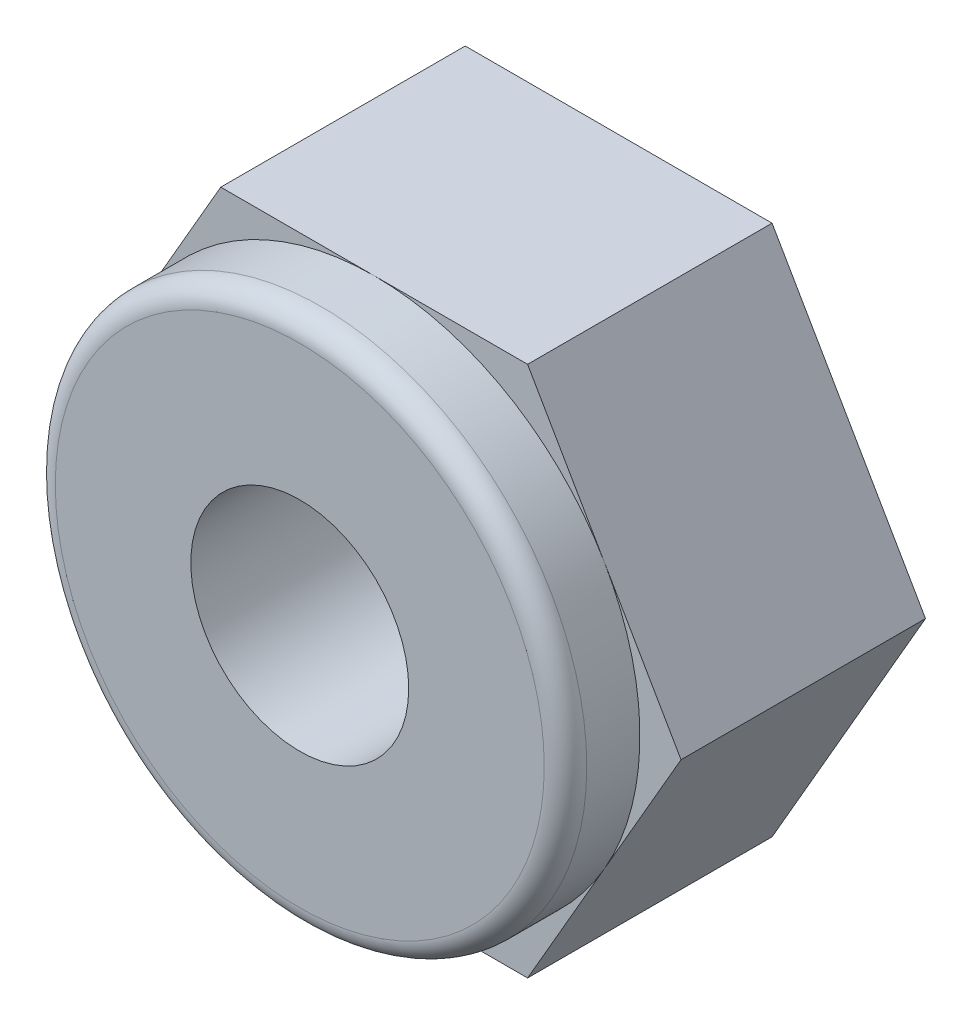
ISO-10303-21;
HEADER;
FILE_DESCRIPTION(('STEP AP214'),'2;1');
FILE_NAME('part.step','',(''),(''),'','','');
FILE_SCHEMA(('AUTOMOTIVE_DESIGN { 1 0 10303 214 1 1 1 1 }'));
ENDSEC;
DATA;
#1=APPLICATION_CONTEXT('core data for automotive mechanical design processes');
#2=APPLICATION_PROTOCOL_DEFINITION('international standard','automotive_design',2000,#1);
#3=PRODUCT_CONTEXT('',#1,'mechanical');
#4=PRODUCT('Part','Part','',(#3));
#5=PRODUCT_RELATED_PRODUCT_CATEGORY('part','',(#4));
#6=PRODUCT_DEFINITION_FORMATION('','',#4);
#7=PRODUCT_DEFINITION_CONTEXT('part definition',#1,'design');
#8=PRODUCT_DEFINITION('design','',#6,#7);
#9=PRODUCT_DEFINITION_SHAPE('','',#8);
#10=(LENGTH_UNIT() NAMED_UNIT(*) SI_UNIT(.MILLI.,.METRE.));
#11=(NAMED_UNIT(*) PLANE_ANGLE_UNIT() SI_UNIT($,.RADIAN.));
#12=(NAMED_UNIT(*) SI_UNIT($,.STERADIAN.) SOLID_ANGLE_UNIT());
#13=UNCERTAINTY_MEASURE_WITH_UNIT(LENGTH_MEASURE(1.E-05),#10,'distance_accuracy_value','');
#14=(GEOMETRIC_REPRESENTATION_CONTEXT(3) GLOBAL_UNCERTAINTY_ASSIGNED_CONTEXT((#13)) GLOBAL_UNIT_ASSIGNED_CONTEXT((#10,
#11,#12)) REPRESENTATION_CONTEXT('',''));
#15=CARTESIAN_POINT('',(0.,0.,0.));
#16=DIRECTION('',(0.,0.,1.));
#17=DIRECTION('',(1.,0.,0.));
#18=AXIS2_PLACEMENT_3D('',#15,#16,#17);
#19=CARTESIAN_POINT('',(0.,0.,2.3));
#20=DIRECTION('',(0.,0.,1.));
#21=DIRECTION('',(1.,0.,0.));
#22=AXIS2_PLACEMENT_3D('',#19,#20,#21);
#23=PLANE('',#22);
#24=DIRECTION('',(0.500000000000007,-0.866025403784435,0.));
#25=VECTOR('',#24,1.);
#26=CARTESIAN_POINT('',(-2.16506350946108,-1.25000000000001,2.3));
#27=LINE('',#26,#25);
#28=CARTESIAN_POINT('',(-2.16506350946108,-1.25000000000001,2.3));
#29=VERTEX_POINT('',#28);
#30=CARTESIAN_POINT('',(-1.44337567297404,-2.50000000000001,2.3));
#31=VERTEX_POINT('',#30);
#32=EDGE_CURVE('E123',#29,#31,#27,.T.);
#33=ORIENTED_EDGE('',*,*,#32,.T.);
#34=DIRECTION('',(1.,0.,0.));
#35=VECTOR('',#34,1.);
#36=CARTESIAN_POINT('',(0.,-2.50000000000001,2.3));
#37=LINE('',#36,#35);
#38=CARTESIAN_POINT('',(0.,-2.5,2.3));
#39=VERTEX_POINT('',#38);
#40=EDGE_CURVE('E93',#31,#39,#37,.T.);
#41=ORIENTED_EDGE('',*,*,#40,.T.);
#42=CARTESIAN_POINT('',(0.,0.,2.3));
#43=DIRECTION('',(0.,0.,-1.));
#44=DIRECTION('',(-1.,0.,0.));
#45=AXIS2_PLACEMENT_3D('',#42,#43,#44);
#46=CIRCLE('',#45,2.49999999999999);
#47=EDGE_CURVE('E103',#29,#39,#46,.F.);
#48=ORIENTED_EDGE('',*,*,#47,.F.);
#49=EDGE_LOOP('',(#33,#41,#48));
#50=FACE_BOUND('',#49,.T.);
#51=ADVANCED_FACE('F17',(#50),#23,.T.);
#52=CARTESIAN_POINT('',(0.,0.,2.3));
#53=DIRECTION('',(0.,0.,1.));
#54=DIRECTION('',(1.,0.,0.));
#55=AXIS2_PLACEMENT_3D('',#52,#53,#54);
#56=PLANE('',#55);
#57=DIRECTION('',(1.,0.,0.));
#58=VECTOR('',#57,1.);
#59=CARTESIAN_POINT('',(0.,-2.49999999999999,2.3));
#60=LINE('',#59,#58);
#61=CARTESIAN_POINT('',(1.44337567297408,-2.49999999999999,2.3));
#62=VERTEX_POINT('',#61);
#63=EDGE_CURVE('E133',#39,#62,#60,.T.);
#64=ORIENTED_EDGE('',*,*,#63,.T.);
#65=DIRECTION('',(0.499999999999995,0.866025403784442,0.));
#66=VECTOR('',#65,1.);
#67=CARTESIAN_POINT('',(1.44337567297409,-2.49999999999998,2.3));
#68=LINE('',#67,#66);
#69=CARTESIAN_POINT('',(2.1650635094611,-1.24999999999998,2.3));
#70=VERTEX_POINT('',#69);
#71=EDGE_CURVE('E128',#62,#70,#68,.T.);
#72=ORIENTED_EDGE('',*,*,#71,.T.);
#73=CARTESIAN_POINT('',(0.,0.,2.3));
#74=DIRECTION('',(0.,0.,-1.));
#75=DIRECTION('',(-1.,0.,0.));
#76=AXIS2_PLACEMENT_3D('',#73,#74,#75);
#77=CIRCLE('',#76,2.49999999999999);
#78=EDGE_CURVE('E127',#39,#70,#77,.F.);
#79=ORIENTED_EDGE('',*,*,#78,.F.);
#80=EDGE_LOOP('',(#64,#72,#79));
#81=FACE_BOUND('',#80,.T.);
#82=ADVANCED_FACE('F307',(#81),#56,.T.);
#83=CARTESIAN_POINT('',(0.,0.,2.3));
#84=DIRECTION('',(0.,0.,1.));
#85=DIRECTION('',(1.,0.,0.));
#86=AXIS2_PLACEMENT_3D('',#83,#84,#85);
#87=PLANE('',#86);
#88=DIRECTION('',(1.,0.,0.));
#89=VECTOR('',#88,1.);
#90=CARTESIAN_POINT('',(0.,2.49999999999999,2.3));
#91=LINE('',#90,#89);
#92=CARTESIAN_POINT('',(0.,2.49999999999999,2.3));
#93=VERTEX_POINT('',#92);
#94=CARTESIAN_POINT('',(-1.44337567297407,2.49999999999999,2.3));
#95=VERTEX_POINT('',#94);
#96=EDGE_CURVE('E130',#93,#95,#91,.F.);
#97=ORIENTED_EDGE('',*,*,#96,.T.);
#98=DIRECTION('',(-0.499999999999995,-0.866025403784441,0.));
#99=VECTOR('',#98,1.);
#100=CARTESIAN_POINT('',(-1.44337567297407,2.49999999999999,2.3));
#101=LINE('',#100,#99);
#102=CARTESIAN_POINT('',(-2.1650635094611,1.24999999999998,2.3));
#103=VERTEX_POINT('',#102);
#104=EDGE_CURVE('E161',#95,#103,#101,.T.);
#105=ORIENTED_EDGE('',*,*,#104,.T.);
#106=CARTESIAN_POINT('',(0.,0.,2.3));
#107=DIRECTION('',(0.,0.,-1.));
#108=DIRECTION('',(-1.,0.,0.));
#109=AXIS2_PLACEMENT_3D('',#106,#107,#108);
#110=CIRCLE('',#109,2.49999999999999);
#111=EDGE_CURVE('E107',#93,#103,#110,.F.);
#112=ORIENTED_EDGE('',*,*,#111,.F.);
#113=EDGE_LOOP('',(#97,#105,#112));
#114=FACE_BOUND('',#113,.T.);
#115=ADVANCED_FACE('F274',(#114),#87,.T.);
#116=CARTESIAN_POINT('',(0.,0.,2.8));
#117=DIRECTION('',(0.,0.,1.));
#118=DIRECTION('',(1.,0.,0.));
#119=AXIS2_PLACEMENT_3D('',#116,#117,#118);
#120=TOROIDAL_SURFACE('',#119,2.29999999999999,0.2);
#121=CARTESIAN_POINT('',(0.,0.,2.8));
#122=DIRECTION('',(0.,0.,-1.));
#123=DIRECTION('',(-1.,0.,0.));
#124=AXIS2_PLACEMENT_3D('',#121,#122,#123);
#125=CIRCLE('',#124,2.49999999999999);
#126=CARTESIAN_POINT('',(-2.49999999999999,0.,2.8));
#127=VERTEX_POINT('',#126);
#128=EDGE_CURVE('E159',#127,#127,#125,.T.);
#129=ORIENTED_EDGE('',*,*,#128,.F.);
#130=EDGE_LOOP('',(#129));
#131=FACE_BOUND('',#130,.T.);
#132=CARTESIAN_POINT('',(0.,0.,3.));
#133=DIRECTION('',(0.,0.,-1.));
#134=DIRECTION('',(1.,0.,0.));
#135=AXIS2_PLACEMENT_3D('',#132,#133,#134);
#136=CIRCLE('',#135,2.29999999999999);
#137=CARTESIAN_POINT('',(-2.29999999999999,0.,3.));
#138=VERTEX_POINT('',#137);
#139=CARTESIAN_POINT('',(2.29999999999999,0.,3.));
#140=VERTEX_POINT('',#139);
#141=EDGE_CURVE('E140',#138,#140,#136,.F.);
#142=ORIENTED_EDGE('',*,*,#141,.F.);
#143=CARTESIAN_POINT('',(0.,0.,3.));
#144=DIRECTION('',(0.,0.,-1.));
#145=DIRECTION('',(-1.,0.,0.));
#146=AXIS2_PLACEMENT_3D('',#143,#144,#145);
#147=CIRCLE('',#146,2.29999999999999);
#148=EDGE_CURVE('E110',#140,#138,#147,.F.);
#149=ORIENTED_EDGE('',*,*,#148,.F.);
#150=EDGE_LOOP('',(#142,#149));
#151=FACE_BOUND('',#150,.T.);
#152=ADVANCED_FACE('F139',(#131,#151),#120,.T.);
#153=CARTESIAN_POINT('',(0.,0.,3.));
#154=DIRECTION('',(0.,0.,-1.));
#155=DIRECTION('',(-1.,0.,0.));
#156=AXIS2_PLACEMENT_3D('',#153,#154,#155);
#157=CYLINDRICAL_SURFACE('',#156,2.49999999999999);
#158=ORIENTED_EDGE('',*,*,#128,.T.);
#159=EDGE_LOOP('',(#158));
#160=FACE_BOUND('',#159,.T.);
#161=CARTESIAN_POINT('',(0.,0.,2.3));
#162=DIRECTION('',(0.,0.,-1.));
#163=DIRECTION('',(-1.,0.,0.));
#164=AXIS2_PLACEMENT_3D('',#161,#162,#163);
#165=CIRCLE('',#164,2.49999999999999);
#166=EDGE_CURVE('E99',#103,#29,#165,.F.);
#167=ORIENTED_EDGE('',*,*,#166,.T.);
#168=ORIENTED_EDGE('',*,*,#47,.T.);
#169=ORIENTED_EDGE('',*,*,#78,.T.);
#170=CARTESIAN_POINT('',(0.,0.,2.3));
#171=DIRECTION('',(0.,0.,-1.));
#172=DIRECTION('',(-1.,0.,0.));
#173=AXIS2_PLACEMENT_3D('',#170,#171,#172);
#174=CIRCLE('',#173,2.49999999999999);
#175=CARTESIAN_POINT('',(2.16506350946109,1.25,2.3));
#176=VERTEX_POINT('',#175);
#177=EDGE_CURVE('E158',#70,#176,#174,.F.);
#178=ORIENTED_EDGE('',*,*,#177,.T.);
#179=CARTESIAN_POINT('',(0.,0.,2.3));
#180=DIRECTION('',(0.,0.,-1.));
#181=DIRECTION('',(-1.,0.,0.));
#182=AXIS2_PLACEMENT_3D('',#179,#180,#181);
#183=CIRCLE('',#182,2.49999999999999);
#184=EDGE_CURVE('E144',#93,#176,#183,.T.);
#185=ORIENTED_EDGE('',*,*,#184,.F.);
#186=ORIENTED_EDGE('',*,*,#111,.T.);
#187=EDGE_LOOP('',(#167,#168,#169,#178,#185,#186));
#188=FACE_BOUND('',#187,.T.);
#189=ADVANCED_FACE('F101',(#160,#188),#157,.T.);
#190=CARTESIAN_POINT('',(0.,0.,3.));
#191=DIRECTION('',(0.,0.,1.));
#192=DIRECTION('',(1.,0.,0.));
#193=AXIS2_PLACEMENT_3D('',#190,#191,#192);
#194=PLANE('',#193);
#195=ORIENTED_EDGE('',*,*,#148,.T.);
#196=ORIENTED_EDGE('',*,*,#141,.T.);
#197=EDGE_LOOP('',(#195,#196));
#198=FACE_BOUND('',#197,.T.);
#199=CARTESIAN_POINT('',(0.,0.,3.));
#200=DIRECTION('',(0.,0.,1.));
#201=DIRECTION('',(1.,0.,0.));
#202=AXIS2_PLACEMENT_3D('',#199,#200,#201);
#203=CIRCLE('',#202,1.025);
#204=CARTESIAN_POINT('',(1.025,0.,3.));
#205=VERTEX_POINT('',#204);
#206=EDGE_CURVE('E153',#205,#205,#203,.F.);
#207=ORIENTED_EDGE('',*,*,#206,.T.);
#208=EDGE_LOOP('',(#207));
#209=FACE_BOUND('',#208,.T.);
#210=ADVANCED_FACE('F248',(#198,#209),#194,.T.);
#211=CARTESIAN_POINT('',(0.,0.,2.3));
#212=DIRECTION('',(0.,0.,1.));
#213=DIRECTION('',(1.,0.,0.));
#214=AXIS2_PLACEMENT_3D('',#211,#212,#213);
#215=PLANE('',#214);
#216=DIRECTION('',(0.500000000000001,-0.866025403784438,0.));
#217=VECTOR('',#216,1.);
#218=CARTESIAN_POINT('',(2.88675134594812,0.,2.3));
#219=LINE('',#218,#217);
#220=CARTESIAN_POINT('',(1.44337567297405,2.5,2.3));
#221=VERTEX_POINT('',#220);
#222=EDGE_CURVE('E215',#176,#221,#219,.F.);
#223=ORIENTED_EDGE('',*,*,#222,.T.);
#224=DIRECTION('',(1.,0.,0.));
#225=VECTOR('',#224,1.);
#226=CARTESIAN_POINT('',(0.,2.5,2.3));
#227=LINE('',#226,#225);
#228=EDGE_CURVE('E147',#221,#93,#227,.F.);
#229=ORIENTED_EDGE('',*,*,#228,.T.);
#230=ORIENTED_EDGE('',*,*,#184,.T.);
#231=EDGE_LOOP('',(#223,#229,#230));
#232=FACE_BOUND('',#231,.T.);
#233=ADVANCED_FACE('F258',(#232),#215,.T.);
#234=CARTESIAN_POINT('',(0.,0.,2.3));
#235=DIRECTION('',(0.,0.,1.));
#236=DIRECTION('',(1.,0.,0.));
#237=AXIS2_PLACEMENT_3D('',#234,#235,#236);
#238=PLANE('',#237);
#239=DIRECTION('',(-0.500000000000007,0.866025403784435,0.));
#240=VECTOR('',#239,1.);
#241=CARTESIAN_POINT('',(-2.88675134594812,0.,2.3));
#242=LINE('',#241,#240);
#243=CARTESIAN_POINT('',(-2.88675134594812,0.,2.3));
#244=VERTEX_POINT('',#243);
#245=EDGE_CURVE('E113',#244,#29,#242,.F.);
#246=ORIENTED_EDGE('',*,*,#245,.T.);
#247=ORIENTED_EDGE('',*,*,#166,.F.);
#248=DIRECTION('',(0.499999999999995,0.866025403784442,0.));
#249=VECTOR('',#248,1.);
#250=CARTESIAN_POINT('',(-1.44337567297407,2.49999999999999,2.3));
#251=LINE('',#250,#249);
#252=EDGE_CURVE('E116',#103,#244,#251,.F.);
#253=ORIENTED_EDGE('',*,*,#252,.T.);
#254=EDGE_LOOP('',(#246,#247,#253));
#255=FACE_BOUND('',#254,.T.);
#256=ADVANCED_FACE('F115',(#255),#238,.T.);
#257=CARTESIAN_POINT('',(0.,0.,2.3));
#258=DIRECTION('',(0.,0.,1.));
#259=DIRECTION('',(1.,0.,0.));
#260=AXIS2_PLACEMENT_3D('',#257,#258,#259);
#261=PLANE('',#260);
#262=DIRECTION('',(0.500000000000001,-0.866025403784438,0.));
#263=VECTOR('',#262,1.);
#264=CARTESIAN_POINT('',(2.88675134594812,0.,2.3));
#265=LINE('',#264,#263);
#266=CARTESIAN_POINT('',(2.88675134594812,0.,2.3));
#267=VERTEX_POINT('',#266);
#268=EDGE_CURVE('E212',#267,#176,#265,.F.);
#269=ORIENTED_EDGE('',*,*,#268,.T.);
#270=ORIENTED_EDGE('',*,*,#177,.F.);
#271=DIRECTION('',(-0.499999999999995,-0.866025403784442,0.));
#272=VECTOR('',#271,1.);
#273=CARTESIAN_POINT('',(1.44337567297409,-2.49999999999998,2.3));
#274=LINE('',#273,#272);
#275=EDGE_CURVE('E187',#70,#267,#274,.F.);
#276=ORIENTED_EDGE('',*,*,#275,.T.);
#277=EDGE_LOOP('',(#269,#270,#276));
#278=FACE_BOUND('',#277,.T.);
#279=ADVANCED_FACE('F311',(#278),#261,.T.);
#280=CARTESIAN_POINT('',(0.,0.,3.));
#281=DIRECTION('',(0.,0.,1.));
#282=DIRECTION('',(1.,0.,0.));
#283=AXIS2_PLACEMENT_3D('',#280,#281,#282);
#284=CYLINDRICAL_SURFACE('',#283,1.025);
#285=CARTESIAN_POINT('',(0.,0.,0.));
#286=DIRECTION('',(0.,0.,1.));
#287=DIRECTION('',(1.,0.,0.));
#288=AXIS2_PLACEMENT_3D('',#285,#286,#287);
#289=CIRCLE('',#288,1.025);
#290=CARTESIAN_POINT('',(1.025,0.,0.));
#291=VERTEX_POINT('',#290);
#292=EDGE_CURVE('E192',#291,#291,#289,.F.);
#293=ORIENTED_EDGE('',*,*,#292,.T.);
#294=EDGE_LOOP('',(#293));
#295=FACE_BOUND('',#294,.T.);
#296=ORIENTED_EDGE('',*,*,#206,.F.);
#297=EDGE_LOOP('',(#296));
#298=FACE_BOUND('',#297,.T.);
#299=ADVANCED_FACE('F335',(#295,#298),#284,.F.);
#300=CARTESIAN_POINT('',(2.88675134594812,0.,2.3));
#301=DIRECTION('',(-0.866025403784438,-0.500000000000001,0.));
#302=DIRECTION('',(0.500000000000001,-0.866025403784438,0.));
#303=AXIS2_PLACEMENT_3D('',#300,#301,#302);
#304=PLANE('',#303);
#305=DIRECTION('',(0.,0.,1.));
#306=VECTOR('',#305,1.);
#307=CARTESIAN_POINT('',(1.44337567297405,2.5,2.3));
#308=LINE('',#307,#306);
#309=CARTESIAN_POINT('',(1.44337567297405,2.5,0.));
#310=VERTEX_POINT('',#309);
#311=EDGE_CURVE('E173',#310,#221,#308,.T.);
#312=ORIENTED_EDGE('',*,*,#311,.T.);
#313=ORIENTED_EDGE('',*,*,#222,.F.);
#314=ORIENTED_EDGE('',*,*,#268,.F.);
#315=DIRECTION('',(0.,0.,1.));
#316=VECTOR('',#315,1.);
#317=CARTESIAN_POINT('',(2.88675134594812,0.,2.3));
#318=LINE('',#317,#316);
#319=CARTESIAN_POINT('',(2.88675134594812,0.,0.));
#320=VERTEX_POINT('',#319);
#321=EDGE_CURVE('E195',#267,#320,#318,.F.);
#322=ORIENTED_EDGE('',*,*,#321,.T.);
#323=DIRECTION('',(-0.500000000000001,0.866025403784438,0.));
#324=VECTOR('',#323,1.);
#325=CARTESIAN_POINT('',(2.88675134594812,0.,0.));
#326=LINE('',#325,#324);
#327=EDGE_CURVE('E194',#320,#310,#326,.T.);
#328=ORIENTED_EDGE('',*,*,#327,.T.);
#329=EDGE_LOOP('',(#312,#313,#314,#322,#328));
#330=FACE_BOUND('',#329,.T.);
#331=ADVANCED_FACE('F312',(#330),#304,.F.);
#332=CARTESIAN_POINT('',(1.44337567297405,2.5,2.3));
#333=DIRECTION('',(0.,-1.,0.));
#334=DIRECTION('',(1.,0.,0.));
#335=AXIS2_PLACEMENT_3D('',#332,#333,#334);
#336=PLANE('',#335);
#337=DIRECTION('',(0.,0.,1.));
#338=VECTOR('',#337,1.);
#339=CARTESIAN_POINT('',(-1.44337567297407,2.49999999999999,2.3));
#340=LINE('',#339,#338);
#341=CARTESIAN_POINT('',(-1.44337567297407,2.49999999999999,0.));
#342=VERTEX_POINT('',#341);
#343=EDGE_CURVE('E170',#342,#95,#340,.T.);
#344=ORIENTED_EDGE('',*,*,#343,.T.);
#345=ORIENTED_EDGE('',*,*,#96,.F.);
#346=ORIENTED_EDGE('',*,*,#228,.F.);
#347=ORIENTED_EDGE('',*,*,#311,.F.);
#348=DIRECTION('',(1.,0.,0.));
#349=VECTOR('',#348,1.);
#350=CARTESIAN_POINT('',(0.,2.5,0.));
#351=LINE('',#350,#349);
#352=EDGE_CURVE('E199',#310,#342,#351,.F.);
#353=ORIENTED_EDGE('',*,*,#352,.T.);
#354=EDGE_LOOP('',(#344,#345,#346,#347,#353));
#355=FACE_BOUND('',#354,.T.);
#356=ADVANCED_FACE('F290',(#355),#336,.F.);
#357=CARTESIAN_POINT('',(-1.44337567297407,2.49999999999999,2.3));
#358=DIRECTION('',(0.866025403784442,-0.499999999999995,0.));
#359=DIRECTION('',(0.499999999999995,0.866025403784442,0.));
#360=AXIS2_PLACEMENT_3D('',#357,#358,#359);
#361=PLANE('',#360);
#362=DIRECTION('',(0.,0.,1.));
#363=VECTOR('',#362,1.);
#364=CARTESIAN_POINT('',(-2.88675134594812,0.,2.3));
#365=LINE('',#364,#363);
#366=CARTESIAN_POINT('',(-2.88675134594812,0.,0.));
#367=VERTEX_POINT('',#366);
#368=EDGE_CURVE('E120',#367,#244,#365,.T.);
#369=ORIENTED_EDGE('',*,*,#368,.T.);
#370=ORIENTED_EDGE('',*,*,#252,.F.);
#371=ORIENTED_EDGE('',*,*,#104,.F.);
#372=ORIENTED_EDGE('',*,*,#343,.F.);
#373=DIRECTION('',(-0.499999999999995,-0.866025403784442,0.));
#374=VECTOR('',#373,1.);
#375=CARTESIAN_POINT('',(-1.44337567297407,2.49999999999999,0.));
#376=LINE('',#375,#374);
#377=EDGE_CURVE('E228',#342,#367,#376,.T.);
#378=ORIENTED_EDGE('',*,*,#377,.T.);
#379=EDGE_LOOP('',(#369,#370,#371,#372,#378));
#380=FACE_BOUND('',#379,.T.);
#381=ADVANCED_FACE('F294',(#380),#361,.F.);
#382=CARTESIAN_POINT('',(-2.88675134594812,0.,2.3));
#383=DIRECTION('',(0.866025403784435,0.500000000000007,0.));
#384=DIRECTION('',(-0.500000000000007,0.866025403784435,0.));
#385=AXIS2_PLACEMENT_3D('',#382,#383,#384);
#386=PLANE('',#385);
#387=DIRECTION('',(0.,0.,1.));
#388=VECTOR('',#387,1.);
#389=CARTESIAN_POINT('',(-1.44337567297404,-2.50000000000001,2.3));
#390=LINE('',#389,#388);
#391=CARTESIAN_POINT('',(-1.44337567297404,-2.5,0.));
#392=VERTEX_POINT('',#391);
#393=EDGE_CURVE('E119',#392,#31,#390,.T.);
#394=ORIENTED_EDGE('',*,*,#393,.T.);
#395=ORIENTED_EDGE('',*,*,#32,.F.);
#396=ORIENTED_EDGE('',*,*,#245,.F.);
#397=ORIENTED_EDGE('',*,*,#368,.F.);
#398=DIRECTION('',(0.500000000000007,-0.866025403784434,0.));
#399=VECTOR('',#398,1.);
#400=CARTESIAN_POINT('',(-2.88675134594812,0.,0.));
#401=LINE('',#400,#399);
#402=EDGE_CURVE('E226',#367,#392,#401,.T.);
#403=ORIENTED_EDGE('',*,*,#402,.T.);
#404=EDGE_LOOP('',(#394,#395,#396,#397,#403));
#405=FACE_BOUND('',#404,.T.);
#406=ADVANCED_FACE('F124',(#405),#386,.F.);
#407=CARTESIAN_POINT('',(-1.44337567297404,-2.50000000000001,2.3));
#408=DIRECTION('',(0.,1.,0.));
#409=DIRECTION('',(-1.,0.,0.));
#410=AXIS2_PLACEMENT_3D('',#407,#408,#409);
#411=PLANE('',#410);
#412=DIRECTION('',(0.,0.,1.));
#413=VECTOR('',#412,1.);
#414=CARTESIAN_POINT('',(1.44337567297409,-2.49999999999998,2.3));
#415=LINE('',#414,#413);
#416=CARTESIAN_POINT('',(1.44337567297409,-2.49999999999998,0.));
#417=VERTEX_POINT('',#416);
#418=EDGE_CURVE('E36',#417,#62,#415,.T.);
#419=ORIENTED_EDGE('',*,*,#418,.T.);
#420=ORIENTED_EDGE('',*,*,#63,.F.);
#421=ORIENTED_EDGE('',*,*,#40,.F.);
#422=ORIENTED_EDGE('',*,*,#393,.F.);
#423=DIRECTION('',(1.,0.,0.));
#424=VECTOR('',#423,1.);
#425=CARTESIAN_POINT('',(0.,-2.50000000000001,0.));
#426=LINE('',#425,#424);
#427=EDGE_CURVE('E28',#392,#417,#426,.T.);
#428=ORIENTED_EDGE('',*,*,#427,.T.);
#429=EDGE_LOOP('',(#419,#420,#421,#422,#428));
#430=FACE_BOUND('',#429,.T.);
#431=ADVANCED_FACE('F304',(#430),#411,.F.);
#432=CARTESIAN_POINT('',(1.44337567297409,-2.49999999999998,2.3));
#433=DIRECTION('',(-0.866025403784442,0.499999999999995,0.));
#434=DIRECTION('',(-0.499999999999995,-0.866025403784442,0.));
#435=AXIS2_PLACEMENT_3D('',#432,#433,#434);
#436=PLANE('',#435);
#437=ORIENTED_EDGE('',*,*,#321,.F.);
#438=ORIENTED_EDGE('',*,*,#275,.F.);
#439=ORIENTED_EDGE('',*,*,#71,.F.);
#440=ORIENTED_EDGE('',*,*,#418,.F.);
#441=DIRECTION('',(0.499999999999995,0.866025403784441,0.));
#442=VECTOR('',#441,1.);
#443=CARTESIAN_POINT('',(1.44337567297409,-2.49999999999998,0.));
#444=LINE('',#443,#442);
#445=EDGE_CURVE('E11',#417,#320,#444,.T.);
#446=ORIENTED_EDGE('',*,*,#445,.T.);
#447=EDGE_LOOP('',(#437,#438,#439,#440,#446));
#448=FACE_BOUND('',#447,.T.);
#449=ADVANCED_FACE('F309',(#448),#436,.F.);
#450=CARTESIAN_POINT('',(0.,0.,0.));
#451=DIRECTION('',(0.,0.,1.));
#452=DIRECTION('',(1.,0.,0.));
#453=AXIS2_PLACEMENT_3D('',#450,#451,#452);
#454=PLANE('',#453);
#455=ORIENTED_EDGE('',*,*,#427,.F.);
#456=ORIENTED_EDGE('',*,*,#402,.F.);
#457=ORIENTED_EDGE('',*,*,#377,.F.);
#458=ORIENTED_EDGE('',*,*,#352,.F.);
#459=ORIENTED_EDGE('',*,*,#327,.F.);
#460=ORIENTED_EDGE('',*,*,#445,.F.);
#461=EDGE_LOOP('',(#455,#456,#457,#458,#459,#460));
#462=FACE_BOUND('',#461,.T.);
#463=ORIENTED_EDGE('',*,*,#292,.F.);
#464=EDGE_LOOP('',(#463));
#465=FACE_BOUND('',#464,.T.);
#466=ADVANCED_FACE('F298',(#462,#465),#454,.F.);
#467=CLOSED_SHELL('',(#51,#82,#115,#152,#189,#210,#233,#256,#279,#299,#331,#356,#381,#406,#431,
#449,#466));
#468=MANIFOLD_SOLID_BREP('B1',#467);
#469=ADVANCED_BREP_SHAPE_REPRESENTATION('',(#18,#468),#14);
#470=SHAPE_DEFINITION_REPRESENTATION(#9,#469);
ENDSEC;
END-ISO-10303-21;
